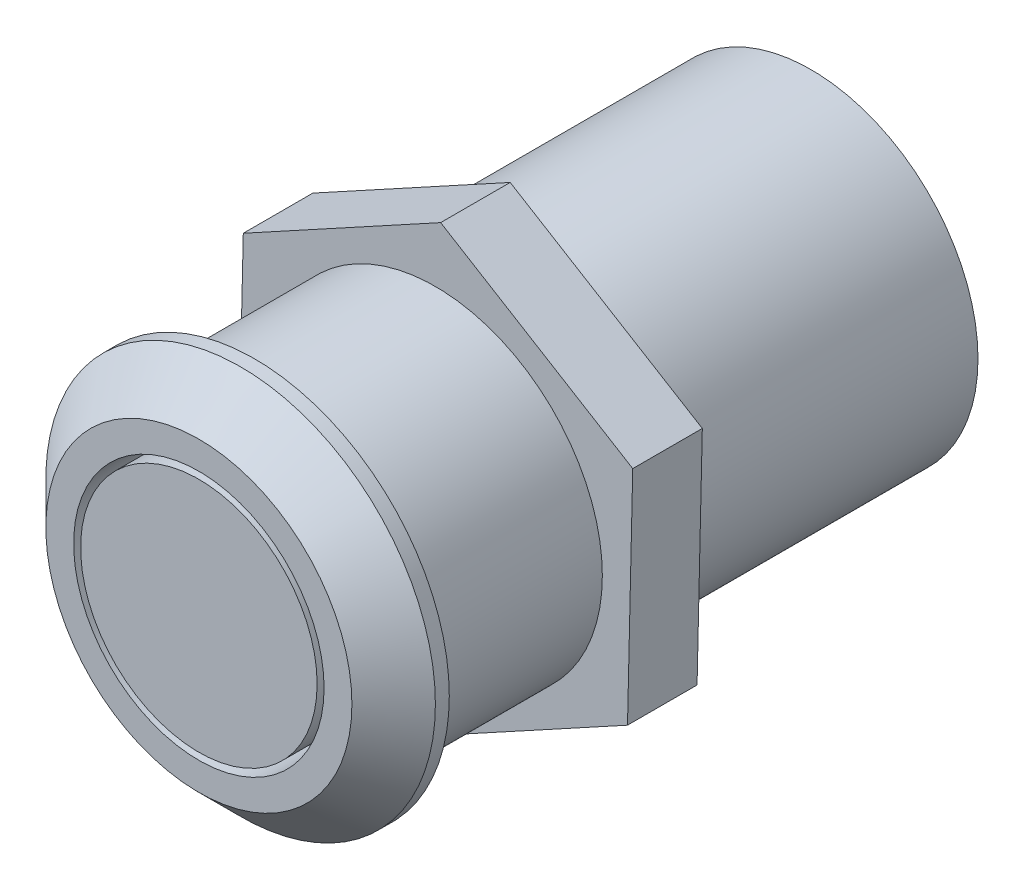
ISO-10303-21;
HEADER;
FILE_DESCRIPTION(('STEP AP214'),'2;1');
FILE_NAME('part.step','',(''),(''),'','','');
FILE_SCHEMA(('AUTOMOTIVE_DESIGN { 1 0 10303 214 1 1 1 1 }'));
ENDSEC;
DATA;
#1=APPLICATION_CONTEXT('core data for automotive mechanical design processes');
#2=APPLICATION_PROTOCOL_DEFINITION('international standard','automotive_design',2000,#1);
#3=PRODUCT_CONTEXT('',#1,'mechanical');
#4=PRODUCT('Part','Part','',(#3));
#5=PRODUCT_RELATED_PRODUCT_CATEGORY('part','',(#4));
#6=PRODUCT_DEFINITION_FORMATION('','',#4);
#7=PRODUCT_DEFINITION_CONTEXT('part definition',#1,'design');
#8=PRODUCT_DEFINITION('design','',#6,#7);
#9=PRODUCT_DEFINITION_SHAPE('','',#8);
#10=(LENGTH_UNIT() NAMED_UNIT(*) SI_UNIT(.MILLI.,.METRE.));
#11=(NAMED_UNIT(*) PLANE_ANGLE_UNIT() SI_UNIT($,.RADIAN.));
#12=(NAMED_UNIT(*) SI_UNIT($,.STERADIAN.) SOLID_ANGLE_UNIT());
#13=UNCERTAINTY_MEASURE_WITH_UNIT(LENGTH_MEASURE(1.E-05),#10,'distance_accuracy_value','');
#14=(GEOMETRIC_REPRESENTATION_CONTEXT(3) GLOBAL_UNCERTAINTY_ASSIGNED_CONTEXT((#13)) GLOBAL_UNIT_ASSIGNED_CONTEXT((#10,
#11,#12)) REPRESENTATION_CONTEXT('',''));
#15=CARTESIAN_POINT('',(0.,0.,0.));
#16=DIRECTION('',(0.,0.,1.));
#17=DIRECTION('',(1.,0.,0.));
#18=AXIS2_PLACEMENT_3D('',#15,#16,#17);
#19=CARTESIAN_POINT('',(0.,0.,0.));
#20=DIRECTION('',(0.,0.,1.));
#21=DIRECTION('',(1.,0.,0.));
#22=AXIS2_PLACEMENT_3D('',#19,#20,#21);
#23=PLANE('',#22);
#24=CARTESIAN_POINT('',(5.,0.,0.));
#25=DIRECTION('',(0.,0.,1.));
#26=DIRECTION('',(1.,0.,0.));
#27=AXIS2_PLACEMENT_3D('',#24,#25,#26);
#28=CIRCLE('',#27,0.5);
#29=CARTESIAN_POINT('',(4.5,0.,0.));
#30=VERTEX_POINT('',#29);
#31=EDGE_CURVE('E115',#30,#30,#28,.T.);
#32=ORIENTED_EDGE('',*,*,#31,.T.);
#33=EDGE_LOOP('',(#32));
#34=FACE_BOUND('',#33,.T.);
#35=CARTESIAN_POINT('',(-5.00000007450581,0.,0.));
#36=DIRECTION('',(0.,0.,1.));
#37=DIRECTION('',(1.,0.,0.));
#38=AXIS2_PLACEMENT_3D('',#35,#36,#37);
#39=CIRCLE('',#38,0.5);
#40=CARTESIAN_POINT('',(-5.50000007450581,0.,0.));
#41=VERTEX_POINT('',#40);
#42=EDGE_CURVE('E552',#41,#41,#39,.T.);
#43=ORIENTED_EDGE('',*,*,#42,.T.);
#44=EDGE_LOOP('',(#43));
#45=FACE_BOUND('',#44,.T.);
#46=CARTESIAN_POINT('',(0.,0.,0.));
#47=DIRECTION('',(0.,0.,1.));
#48=DIRECTION('',(1.,0.,0.));
#49=AXIS2_PLACEMENT_3D('',#46,#47,#48);
#50=CIRCLE('',#49,6.);
#51=CARTESIAN_POINT('',(-6.,0.,0.));
#52=VERTEX_POINT('',#51);
#53=EDGE_CURVE('E11',#52,#52,#50,.T.);
#54=ORIENTED_EDGE('',*,*,#53,.F.);
#55=EDGE_LOOP('',(#54));
#56=FACE_BOUND('',#55,.T.);
#57=ADVANCED_FACE('F17',(#34,#45,#56),#23,.F.);
#58=CARTESIAN_POINT('',(0.,0.,0.));
#59=DIRECTION('',(0.,0.,1.));
#60=DIRECTION('',(1.,0.,0.));
#61=AXIS2_PLACEMENT_3D('',#58,#59,#60);
#62=CYLINDRICAL_SURFACE('',#61,6.);
#63=CARTESIAN_POINT('',(0.,0.,11.));
#64=DIRECTION('',(0.,0.,-1.));
#65=DIRECTION('',(1.,0.,0.));
#66=AXIS2_PLACEMENT_3D('',#63,#64,#65);
#67=CIRCLE('',#66,6.);
#68=CARTESIAN_POINT('',(-6.,0.,11.));
#69=VERTEX_POINT('',#68);
#70=EDGE_CURVE('E109',#69,#69,#67,.T.);
#71=ORIENTED_EDGE('',*,*,#70,.T.);
#72=DIRECTION('',(0.,0.,-1.));
#73=VECTOR('',#72,1.);
#74=CARTESIAN_POINT('',(-6.,0.,0.));
#75=LINE('',#74,#73);
#76=EDGE_CURVE('E21',#69,#52,#75,.T.);
#77=ORIENTED_EDGE('',*,*,#76,.T.);
#78=ORIENTED_EDGE('',*,*,#53,.T.);
#79=ORIENTED_EDGE('',*,*,#76,.F.);
#80=EDGE_LOOP('',(#71,#77,#78,#79));
#81=FACE_BOUND('',#80,.T.);
#82=ADVANCED_FACE('F237',(#81),#62,.T.);
#83=CARTESIAN_POINT('',(0.,0.,20.));
#84=DIRECTION('',(0.,0.,1.));
#85=DIRECTION('',(0.,-1.,0.));
#86=AXIS2_PLACEMENT_3D('',#83,#84,#85);
#87=PLANE('',#86);
#88=CARTESIAN_POINT('',(0.,0.,20.));
#89=DIRECTION('',(0.,0.,1.));
#90=DIRECTION('',(1.,0.,0.));
#91=AXIS2_PLACEMENT_3D('',#88,#89,#90);
#92=CIRCLE('',#91,6.);
#93=CARTESIAN_POINT('',(-6.,0.,20.));
#94=VERTEX_POINT('',#93);
#95=EDGE_CURVE('E179',#94,#94,#92,.T.);
#96=ORIENTED_EDGE('',*,*,#95,.T.);
#97=EDGE_LOOP('',(#96));
#98=FACE_BOUND('',#97,.T.);
#99=CARTESIAN_POINT('',(0.,0.,20.));
#100=DIRECTION('',(0.,0.,1.));
#101=DIRECTION('',(-1.,0.,0.));
#102=AXIS2_PLACEMENT_3D('',#99,#100,#101);
#103=CIRCLE('',#102,7.);
#104=CARTESIAN_POINT('',(7.,0.,20.));
#105=VERTEX_POINT('',#104);
#106=EDGE_CURVE('E114',#105,#105,#103,.T.);
#107=ORIENTED_EDGE('',*,*,#106,.F.);
#108=EDGE_LOOP('',(#107));
#109=FACE_BOUND('',#108,.T.);
#110=ADVANCED_FACE('F19',(#98,#109),#87,.F.);
#111=CARTESIAN_POINT('',(0.,0.,20.));
#112=DIRECTION('',(0.,0.,1.));
#113=DIRECTION('',(0.,-1.,0.));
#114=AXIS2_PLACEMENT_3D('',#111,#112,#113);
#115=PLANE('',#114);
#116=CARTESIAN_POINT('',(0.,0.,20.));
#117=DIRECTION('',(0.,0.,-1.));
#118=DIRECTION('',(-1.,0.,0.));
#119=AXIS2_PLACEMENT_3D('',#116,#117,#118);
#120=CIRCLE('',#119,4.25);
#121=CARTESIAN_POINT('',(4.24999999999993,0.,20.));
#122=VERTEX_POINT('',#121);
#123=EDGE_CURVE('E85',#122,#122,#120,.T.);
#124=ORIENTED_EDGE('',*,*,#123,.T.);
#125=EDGE_LOOP('',(#124));
#126=FACE_BOUND('',#125,.T.);
#127=CARTESIAN_POINT('',(0.,0.,20.));
#128=DIRECTION('',(0.,0.,-1.));
#129=DIRECTION('',(-1.,0.,0.));
#130=AXIS2_PLACEMENT_3D('',#127,#128,#129);
#131=CIRCLE('',#130,4.5);
#132=CARTESIAN_POINT('',(4.49999999999993,0.,20.));
#133=VERTEX_POINT('',#132);
#134=EDGE_CURVE('E49',#133,#133,#131,.T.);
#135=ORIENTED_EDGE('',*,*,#134,.F.);
#136=EDGE_LOOP('',(#135));
#137=FACE_BOUND('',#136,.T.);
#138=ADVANCED_FACE('F236',(#126,#137),#115,.T.);
#139=CARTESIAN_POINT('',(0.,0.,22.));
#140=DIRECTION('',(0.,0.,-1.));
#141=DIRECTION('',(-1.,0.,0.));
#142=AXIS2_PLACEMENT_3D('',#139,#140,#141);
#143=CYLINDRICAL_SURFACE('',#142,4.5);
#144=CARTESIAN_POINT('',(0.,0.,22.));
#145=DIRECTION('',(0.,0.,-1.));
#146=DIRECTION('',(-1.,0.,0.));
#147=AXIS2_PLACEMENT_3D('',#144,#145,#146);
#148=CIRCLE('',#147,4.5);
#149=CARTESIAN_POINT('',(4.49999999999993,0.,22.));
#150=VERTEX_POINT('',#149);
#151=EDGE_CURVE('E95',#150,#150,#148,.T.);
#152=ORIENTED_EDGE('',*,*,#151,.F.);
#153=DIRECTION('',(0.,0.,-1.));
#154=VECTOR('',#153,1.);
#155=CARTESIAN_POINT('',(4.49999999999993,0.,22.));
#156=LINE('',#155,#154);
#157=EDGE_CURVE('E93',#150,#133,#156,.T.);
#158=ORIENTED_EDGE('',*,*,#157,.T.);
#159=ORIENTED_EDGE('',*,*,#134,.T.);
#160=ORIENTED_EDGE('',*,*,#157,.F.);
#161=EDGE_LOOP('',(#152,#158,#159,#160));
#162=FACE_BOUND('',#161,.T.);
#163=ADVANCED_FACE('F245',(#162),#143,.F.);
#164=CARTESIAN_POINT('',(0.,0.,22.));
#165=DIRECTION('',(0.,0.,1.));
#166=DIRECTION('',(0.,-1.,0.));
#167=AXIS2_PLACEMENT_3D('',#164,#165,#166);
#168=PLANE('',#167);
#169=CARTESIAN_POINT('',(0.,0.,22.));
#170=DIRECTION('',(0.,0.,-1.));
#171=DIRECTION('',(-1.,0.,0.));
#172=AXIS2_PLACEMENT_3D('',#169,#170,#171);
#173=CIRCLE('',#172,4.25);
#174=CARTESIAN_POINT('',(4.24999999999993,0.,22.));
#175=VERTEX_POINT('',#174);
#176=EDGE_CURVE('E84',#175,#175,#173,.T.);
#177=ORIENTED_EDGE('',*,*,#176,.F.);
#178=EDGE_LOOP('',(#177));
#179=FACE_BOUND('',#178,.T.);
#180=ADVANCED_FACE('F296',(#179),#168,.T.);
#181=CARTESIAN_POINT('',(0.,0.,20.));
#182=DIRECTION('',(0.,0.,1.));
#183=DIRECTION('',(-1.,0.,0.));
#184=AXIS2_PLACEMENT_3D('',#181,#182,#183);
#185=CYLINDRICAL_SURFACE('',#184,4.25);
#186=ORIENTED_EDGE('',*,*,#176,.T.);
#187=DIRECTION('',(0.,0.,-1.));
#188=VECTOR('',#187,1.);
#189=CARTESIAN_POINT('',(4.24999999999993,0.,20.));
#190=LINE('',#189,#188);
#191=EDGE_CURVE('E81',#175,#122,#190,.T.);
#192=ORIENTED_EDGE('',*,*,#191,.T.);
#193=ORIENTED_EDGE('',*,*,#123,.F.);
#194=ORIENTED_EDGE('',*,*,#191,.F.);
#195=EDGE_LOOP('',(#186,#192,#193,#194));
#196=FACE_BOUND('',#195,.T.);
#197=ADVANCED_FACE('F82',(#196),#185,.T.);
#198=CARTESIAN_POINT('',(0.,0.,22.));
#199=DIRECTION('',(0.,0.,1.));
#200=DIRECTION('',(0.,-1.,0.));
#201=AXIS2_PLACEMENT_3D('',#198,#199,#200);
#202=PLANE('',#201);
#203=ORIENTED_EDGE('',*,*,#151,.T.);
#204=EDGE_LOOP('',(#203));
#205=FACE_BOUND('',#204,.T.);
#206=CARTESIAN_POINT('',(0.,0.,22.));
#207=DIRECTION('',(0.,0.,-1.));
#208=DIRECTION('',(-1.,0.,0.));
#209=AXIS2_PLACEMENT_3D('',#206,#207,#208);
#210=CIRCLE('',#209,5.5);
#211=CARTESIAN_POINT('',(5.49999999999993,0.,22.));
#212=VERTEX_POINT('',#211);
#213=EDGE_CURVE('E121',#212,#212,#210,.T.);
#214=ORIENTED_EDGE('',*,*,#213,.F.);
#215=EDGE_LOOP('',(#214));
#216=FACE_BOUND('',#215,.T.);
#217=ADVANCED_FACE('F292',(#205,#216),#202,.T.);
#218=CARTESIAN_POINT('',(0.,0.,20.));
#219=DIRECTION('',(0.,0.,1.));
#220=DIRECTION('',(-1.,0.,0.));
#221=AXIS2_PLACEMENT_3D('',#218,#219,#220);
#222=CYLINDRICAL_SURFACE('',#221,7.);
#223=CARTESIAN_POINT('',(0.,0.,20.5));
#224=DIRECTION('',(0.,0.,1.));
#225=DIRECTION('',(-1.,0.,0.));
#226=AXIS2_PLACEMENT_3D('',#223,#224,#225);
#227=CIRCLE('',#226,7.);
#228=CARTESIAN_POINT('',(7.,0.,20.5));
#229=VERTEX_POINT('',#228);
#230=EDGE_CURVE('E219',#229,#229,#227,.T.);
#231=ORIENTED_EDGE('',*,*,#230,.F.);
#232=DIRECTION('',(0.,0.,-1.));
#233=VECTOR('',#232,1.);
#234=CARTESIAN_POINT('',(7.,0.,20.));
#235=LINE('',#234,#233);
#236=EDGE_CURVE('E224',#229,#105,#235,.T.);
#237=ORIENTED_EDGE('',*,*,#236,.T.);
#238=ORIENTED_EDGE('',*,*,#106,.T.);
#239=ORIENTED_EDGE('',*,*,#236,.F.);
#240=EDGE_LOOP('',(#231,#237,#238,#239));
#241=FACE_BOUND('',#240,.T.);
#242=ADVANCED_FACE('F233',(#241),#222,.T.);
#243=CARTESIAN_POINT('',(0.,0.,21.25));
#244=DIRECTION('',(0.,0.,-1.));
#245=DIRECTION('',(-1.,0.,0.));
#246=AXIS2_PLACEMENT_3D('',#243,#244,#245);
#247=CONICAL_SURFACE('',#246,6.25,0.785398163397448);
#248=ORIENTED_EDGE('',*,*,#213,.T.);
#249=DIRECTION('',(0.707106781186547,0.,-0.707106781186548));
#250=VECTOR('',#249,1.);
#251=CARTESIAN_POINT('',(6.24999999999993,0.,21.25));
#252=LINE('',#251,#250);
#253=EDGE_CURVE('E125',#212,#229,#252,.T.);
#254=ORIENTED_EDGE('',*,*,#253,.T.);
#255=ORIENTED_EDGE('',*,*,#230,.T.);
#256=ORIENTED_EDGE('',*,*,#253,.F.);
#257=EDGE_LOOP('',(#248,#254,#255,#256));
#258=FACE_BOUND('',#257,.T.);
#259=ADVANCED_FACE('F264',(#258),#247,.T.);
#260=CARTESIAN_POINT('',(0.,0.,0.));
#261=DIRECTION('',(0.,0.,1.));
#262=DIRECTION('',(1.,0.,0.));
#263=AXIS2_PLACEMENT_3D('',#260,#261,#262);
#264=CYLINDRICAL_SURFACE('',#263,6.);
#265=ORIENTED_EDGE('',*,*,#95,.F.);
#266=DIRECTION('',(0.,0.,-1.));
#267=VECTOR('',#266,1.);
#268=CARTESIAN_POINT('',(-6.,0.,0.));
#269=LINE('',#268,#267);
#270=CARTESIAN_POINT('',(-6.,0.,13.5));
#271=VERTEX_POINT('',#270);
#272=EDGE_CURVE('E126',#94,#271,#269,.T.);
#273=ORIENTED_EDGE('',*,*,#272,.T.);
#274=CARTESIAN_POINT('',(0.,0.,13.5));
#275=DIRECTION('',(0.,0.,1.));
#276=DIRECTION('',(1.,0.,0.));
#277=AXIS2_PLACEMENT_3D('',#274,#275,#276);
#278=CIRCLE('',#277,6.);
#279=EDGE_CURVE('E187',#271,#271,#278,.T.);
#280=ORIENTED_EDGE('',*,*,#279,.T.);
#281=ORIENTED_EDGE('',*,*,#272,.F.);
#282=EDGE_LOOP('',(#265,#273,#280,#281));
#283=FACE_BOUND('',#282,.T.);
#284=ADVANCED_FACE('F267',(#283),#264,.T.);
#285=CARTESIAN_POINT('',(-6.90386553885819,4.20356681339779,13.5));
#286=DIRECTION('',(-0.479671618669971,0.877448082932848,0.));
#287=DIRECTION('',(0.,0.,1.));
#288=AXIS2_PLACEMENT_3D('',#285,#286,#287);
#289=PLANE('',#288);
#290=DIRECTION('',(0.877448082932848,0.479671618669971,0.));
#291=VECTOR('',#290,1.);
#292=CARTESIAN_POINT('',(-6.90386553885819,4.20356681339779,13.5));
#293=LINE('',#292,#291);
#294=CARTESIAN_POINT('',(-6.90386553885819,4.20356681339779,13.5));
#295=VERTEX_POINT('',#294);
#296=CARTESIAN_POINT('',(0.188462877478621,8.08070634766203,13.5));
#297=VERTEX_POINT('',#296);
#298=EDGE_CURVE('E131',#295,#297,#293,.T.);
#299=ORIENTED_EDGE('',*,*,#298,.T.);
#300=DIRECTION('',(0.,0.,-1.));
#301=VECTOR('',#300,1.);
#302=CARTESIAN_POINT('',(0.188462877478621,8.08070634766203,13.5));
#303=LINE('',#302,#301);
#304=CARTESIAN_POINT('',(0.188462877478619,8.08070634766204,11.));
#305=VERTEX_POINT('',#304);
#306=EDGE_CURVE('E183',#297,#305,#303,.T.);
#307=ORIENTED_EDGE('',*,*,#306,.T.);
#308=DIRECTION('',(0.877448082932848,0.479671618669971,0.));
#309=VECTOR('',#308,1.);
#310=CARTESIAN_POINT('',(-6.9038655388582,4.20356681339779,11.));
#311=LINE('',#310,#309);
#312=CARTESIAN_POINT('',(-6.9038655388582,4.20356681339779,11.));
#313=VERTEX_POINT('',#312);
#314=EDGE_CURVE('E141',#313,#305,#311,.T.);
#315=ORIENTED_EDGE('',*,*,#314,.F.);
#316=DIRECTION('',(0.,0.,-1.));
#317=VECTOR('',#316,1.);
#318=CARTESIAN_POINT('',(-6.90386553885819,4.20356681339779,13.5));
#319=LINE('',#318,#317);
#320=EDGE_CURVE('E191',#295,#313,#319,.T.);
#321=ORIENTED_EDGE('',*,*,#320,.F.);
#322=EDGE_LOOP('',(#299,#307,#315,#321));
#323=FACE_BOUND('',#322,.T.);
#324=ADVANCED_FACE('F285',(#323),#289,.T.);
#325=CARTESIAN_POINT('',(0.188462877478621,8.08070634766203,13.5));
#326=DIRECTION('',(0.520056520986816,0.854131848709021,0.));
#327=DIRECTION('',(0.,0.,-1.));
#328=AXIS2_PLACEMENT_3D('',#325,#326,#327);
#329=PLANE('',#328);
#330=DIRECTION('',(0.854131848709021,-0.520056520986816,0.));
#331=VECTOR('',#330,1.);
#332=CARTESIAN_POINT('',(0.188462877478621,8.08070634766203,13.5));
#333=LINE('',#332,#331);
#334=CARTESIAN_POINT('',(7.09232841633682,3.87713953426422,13.5));
#335=VERTEX_POINT('',#334);
#336=EDGE_CURVE('E178',#297,#335,#333,.T.);
#337=ORIENTED_EDGE('',*,*,#336,.T.);
#338=DIRECTION('',(0.,0.,-1.));
#339=VECTOR('',#338,1.);
#340=CARTESIAN_POINT('',(7.09232841633682,3.87713953426422,13.5));
#341=LINE('',#340,#339);
#342=CARTESIAN_POINT('',(7.09232841633682,3.87713953426422,11.));
#343=VERTEX_POINT('',#342);
#344=EDGE_CURVE('E207',#335,#343,#341,.T.);
#345=ORIENTED_EDGE('',*,*,#344,.T.);
#346=DIRECTION('',(0.854131848709021,-0.520056520986816,0.));
#347=VECTOR('',#346,1.);
#348=CARTESIAN_POINT('',(0.188462877478619,8.08070634766204,11.));
#349=LINE('',#348,#347);
#350=EDGE_CURVE('E145',#305,#343,#349,.T.);
#351=ORIENTED_EDGE('',*,*,#350,.F.);
#352=ORIENTED_EDGE('',*,*,#306,.F.);
#353=EDGE_LOOP('',(#337,#345,#351,#352));
#354=FACE_BOUND('',#353,.T.);
#355=ADVANCED_FACE('F283',(#354),#329,.T.);
#356=CARTESIAN_POINT('',(7.09232841633682,3.87713953426422,13.5));
#357=DIRECTION('',(0.999728139656787,-0.0233162342238269,0.));
#358=DIRECTION('',(0.,0.,-1.));
#359=AXIS2_PLACEMENT_3D('',#356,#357,#358);
#360=PLANE('',#359);
#361=DIRECTION('',(-0.0233162342238269,-0.999728139656787,0.));
#362=VECTOR('',#361,1.);
#363=CARTESIAN_POINT('',(7.09232841633682,3.87713953426422,13.5));
#364=LINE('',#363,#362);
#365=CARTESIAN_POINT('',(6.90386553885821,-4.20356681339784,13.5));
#366=VERTEX_POINT('',#365);
#367=EDGE_CURVE('E174',#335,#366,#364,.T.);
#368=ORIENTED_EDGE('',*,*,#367,.T.);
#369=DIRECTION('',(0.,0.,-1.));
#370=VECTOR('',#369,1.);
#371=CARTESIAN_POINT('',(6.90386553885821,-4.20356681339784,13.5));
#372=LINE('',#371,#370);
#373=CARTESIAN_POINT('',(6.90386553885821,-4.20356681339783,11.));
#374=VERTEX_POINT('',#373);
#375=EDGE_CURVE('E203',#366,#374,#372,.T.);
#376=ORIENTED_EDGE('',*,*,#375,.T.);
#377=DIRECTION('',(-0.0233162342238269,-0.999728139656787,0.));
#378=VECTOR('',#377,1.);
#379=CARTESIAN_POINT('',(7.09232841633682,3.87713953426422,11.));
#380=LINE('',#379,#378);
#381=EDGE_CURVE('E152',#343,#374,#380,.T.);
#382=ORIENTED_EDGE('',*,*,#381,.F.);
#383=ORIENTED_EDGE('',*,*,#344,.F.);
#384=EDGE_LOOP('',(#368,#376,#382,#383));
#385=FACE_BOUND('',#384,.T.);
#386=ADVANCED_FACE('F279',(#385),#360,.T.);
#387=CARTESIAN_POINT('',(6.90386553885821,-4.20356681339784,13.5));
#388=DIRECTION('',(0.479671618669971,-0.877448082932848,0.));
#389=DIRECTION('',(0.,0.,-1.));
#390=AXIS2_PLACEMENT_3D('',#387,#388,#389);
#391=PLANE('',#390);
#392=DIRECTION('',(-0.877448082932848,-0.479671618669971,0.));
#393=VECTOR('',#392,1.);
#394=CARTESIAN_POINT('',(6.90386553885821,-4.20356681339784,13.5));
#395=LINE('',#394,#393);
#396=CARTESIAN_POINT('',(-0.188462877478595,-8.08070634766208,13.5));
#397=VERTEX_POINT('',#396);
#398=EDGE_CURVE('E170',#366,#397,#395,.T.);
#399=ORIENTED_EDGE('',*,*,#398,.T.);
#400=DIRECTION('',(0.,0.,-1.));
#401=VECTOR('',#400,1.);
#402=CARTESIAN_POINT('',(-0.188462877478595,-8.08070634766208,13.5));
#403=LINE('',#402,#401);
#404=CARTESIAN_POINT('',(-0.188462877478598,-8.08070634766207,11.));
#405=VERTEX_POINT('',#404);
#406=EDGE_CURVE('E199',#397,#405,#403,.T.);
#407=ORIENTED_EDGE('',*,*,#406,.T.);
#408=DIRECTION('',(-0.877448082932848,-0.479671618669971,0.));
#409=VECTOR('',#408,1.);
#410=CARTESIAN_POINT('',(6.90386553885821,-4.20356681339783,11.));
#411=LINE('',#410,#409);
#412=EDGE_CURVE('E153',#374,#405,#411,.T.);
#413=ORIENTED_EDGE('',*,*,#412,.F.);
#414=ORIENTED_EDGE('',*,*,#375,.F.);
#415=EDGE_LOOP('',(#399,#407,#413,#414));
#416=FACE_BOUND('',#415,.T.);
#417=ADVANCED_FACE('F275',(#416),#391,.T.);
#418=CARTESIAN_POINT('',(-0.188462877478595,-8.08070634766208,13.5));
#419=DIRECTION('',(-0.520056520986815,-0.854131848709021,0.));
#420=DIRECTION('',(-0.854131848709021,0.520056520986815,0.));
#421=AXIS2_PLACEMENT_3D('',#418,#419,#420);
#422=PLANE('',#421);
#423=DIRECTION('',(-0.854131848709021,0.520056520986815,0.));
#424=VECTOR('',#423,1.);
#425=CARTESIAN_POINT('',(-0.188462877478595,-8.08070634766208,13.5));
#426=LINE('',#425,#424);
#427=CARTESIAN_POINT('',(-7.0923284163368,-3.87713953426426,13.5));
#428=VERTEX_POINT('',#427);
#429=EDGE_CURVE('E160',#397,#428,#426,.T.);
#430=ORIENTED_EDGE('',*,*,#429,.T.);
#431=DIRECTION('',(0.,0.,-1.));
#432=VECTOR('',#431,1.);
#433=CARTESIAN_POINT('',(-7.0923284163368,-3.87713953426426,13.5));
#434=LINE('',#433,#432);
#435=CARTESIAN_POINT('',(-7.0923284163368,-3.87713953426426,11.));
#436=VERTEX_POINT('',#435);
#437=EDGE_CURVE('E195',#428,#436,#434,.T.);
#438=ORIENTED_EDGE('',*,*,#437,.T.);
#439=DIRECTION('',(-0.854131848709021,0.520056520986815,0.));
#440=VECTOR('',#439,1.);
#441=CARTESIAN_POINT('',(-0.188462877478598,-8.08070634766207,11.));
#442=LINE('',#441,#440);
#443=EDGE_CURVE('E140',#405,#436,#442,.T.);
#444=ORIENTED_EDGE('',*,*,#443,.F.);
#445=ORIENTED_EDGE('',*,*,#406,.F.);
#446=EDGE_LOOP('',(#430,#438,#444,#445));
#447=FACE_BOUND('',#446,.T.);
#448=ADVANCED_FACE('F271',(#447),#422,.T.);
#449=CARTESIAN_POINT('',(-7.0923284163368,-3.87713953426426,13.5));
#450=DIRECTION('',(-0.999728139656787,0.0233162342238267,0.));
#451=DIRECTION('',(0.,0.,1.));
#452=AXIS2_PLACEMENT_3D('',#449,#450,#451);
#453=PLANE('',#452);
#454=DIRECTION('',(0.0233162342238267,0.999728139656787,0.));
#455=VECTOR('',#454,1.);
#456=CARTESIAN_POINT('',(-7.0923284163368,-3.87713953426426,13.5));
#457=LINE('',#456,#455);
#458=EDGE_CURVE('E135',#428,#295,#457,.T.);
#459=ORIENTED_EDGE('',*,*,#458,.T.);
#460=ORIENTED_EDGE('',*,*,#320,.T.);
#461=DIRECTION('',(0.0233162342238267,0.999728139656787,0.));
#462=VECTOR('',#461,1.);
#463=CARTESIAN_POINT('',(-7.0923284163368,-3.87713953426426,11.));
#464=LINE('',#463,#462);
#465=EDGE_CURVE('E136',#436,#313,#464,.T.);
#466=ORIENTED_EDGE('',*,*,#465,.F.);
#467=ORIENTED_EDGE('',*,*,#437,.F.);
#468=EDGE_LOOP('',(#459,#460,#466,#467));
#469=FACE_BOUND('',#468,.T.);
#470=ADVANCED_FACE('F262',(#469),#453,.T.);
#471=CARTESIAN_POINT('',(0.,0.,13.5));
#472=DIRECTION('',(0.,0.,-1.));
#473=DIRECTION('',(-1.,0.,0.));
#474=AXIS2_PLACEMENT_3D('',#471,#472,#473);
#475=PLANE('',#474);
#476=ORIENTED_EDGE('',*,*,#279,.F.);
#477=EDGE_LOOP('',(#476));
#478=FACE_BOUND('',#477,.T.);
#479=ORIENTED_EDGE('',*,*,#298,.F.);
#480=ORIENTED_EDGE('',*,*,#458,.F.);
#481=ORIENTED_EDGE('',*,*,#429,.F.);
#482=ORIENTED_EDGE('',*,*,#398,.F.);
#483=ORIENTED_EDGE('',*,*,#367,.F.);
#484=ORIENTED_EDGE('',*,*,#336,.F.);
#485=EDGE_LOOP('',(#479,#480,#481,#482,#483,#484));
#486=FACE_BOUND('',#485,.T.);
#487=ADVANCED_FACE('F259',(#478,#486),#475,.F.);
#488=CARTESIAN_POINT('',(0.,0.,11.));
#489=DIRECTION('',(0.,0.,-1.));
#490=DIRECTION('',(-1.,0.,0.));
#491=AXIS2_PLACEMENT_3D('',#488,#489,#490);
#492=PLANE('',#491);
#493=ORIENTED_EDGE('',*,*,#70,.F.);
#494=EDGE_LOOP('',(#493));
#495=FACE_BOUND('',#494,.T.);
#496=ORIENTED_EDGE('',*,*,#314,.T.);
#497=ORIENTED_EDGE('',*,*,#350,.T.);
#498=ORIENTED_EDGE('',*,*,#381,.T.);
#499=ORIENTED_EDGE('',*,*,#412,.T.);
#500=ORIENTED_EDGE('',*,*,#443,.T.);
#501=ORIENTED_EDGE('',*,*,#465,.T.);
#502=EDGE_LOOP('',(#496,#497,#498,#499,#500,#501));
#503=FACE_BOUND('',#502,.T.);
#504=ADVANCED_FACE('F257',(#495,#503),#492,.T.);
#505=CARTESIAN_POINT('',(5.,0.,5.));
#506=DIRECTION('',(0.,0.,-1.));
#507=DIRECTION('',(0.,-1.,0.));
#508=AXIS2_PLACEMENT_3D('',#505,#506,#507);
#509=PLANE('',#508);
#510=CARTESIAN_POINT('',(5.,0.,5.));
#511=DIRECTION('',(0.,0.,1.));
#512=DIRECTION('',(1.,0.,0.));
#513=AXIS2_PLACEMENT_3D('',#510,#511,#512);
#514=CIRCLE('',#513,0.5);
#515=CARTESIAN_POINT('',(4.5,0.,5.));
#516=VERTEX_POINT('',#515);
#517=EDGE_CURVE('E130',#516,#516,#514,.T.);
#518=ORIENTED_EDGE('',*,*,#517,.F.);
#519=EDGE_LOOP('',(#518));
#520=FACE_BOUND('',#519,.T.);
#521=ADVANCED_FACE('F390',(#520),#509,.T.);
#522=CARTESIAN_POINT('',(5.,0.,0.));
#523=DIRECTION('',(0.,0.,1.));
#524=DIRECTION('',(1.,0.,0.));
#525=AXIS2_PLACEMENT_3D('',#522,#523,#524);
#526=CYLINDRICAL_SURFACE('',#525,0.5);
#527=ORIENTED_EDGE('',*,*,#31,.F.);
#528=DIRECTION('',(0.,0.,1.));
#529=VECTOR('',#528,1.);
#530=CARTESIAN_POINT('',(4.5,0.,0.));
#531=LINE('',#530,#529);
#532=EDGE_CURVE('E119',#30,#516,#531,.T.);
#533=ORIENTED_EDGE('',*,*,#532,.T.);
#534=ORIENTED_EDGE('',*,*,#517,.T.);
#535=ORIENTED_EDGE('',*,*,#532,.F.);
#536=EDGE_LOOP('',(#527,#533,#534,#535));
#537=FACE_BOUND('',#536,.T.);
#538=ADVANCED_FACE('F398',(#537),#526,.F.);
#539=CARTESIAN_POINT('',(-5.00000007450581,0.,5.));
#540=DIRECTION('',(0.,0.,-1.));
#541=DIRECTION('',(0.,-1.,0.));
#542=AXIS2_PLACEMENT_3D('',#539,#540,#541);
#543=PLANE('',#542);
#544=CARTESIAN_POINT('',(-5.00000007450581,0.,5.));
#545=DIRECTION('',(0.,0.,1.));
#546=DIRECTION('',(1.,0.,0.));
#547=AXIS2_PLACEMENT_3D('',#544,#545,#546);
#548=CIRCLE('',#547,0.5);
#549=CARTESIAN_POINT('',(-5.50000007450581,0.,5.));
#550=VERTEX_POINT('',#549);
#551=EDGE_CURVE('E120',#550,#550,#548,.T.);
#552=ORIENTED_EDGE('',*,*,#551,.F.);
#553=EDGE_LOOP('',(#552));
#554=FACE_BOUND('',#553,.T.);
#555=ADVANCED_FACE('F407',(#554),#543,.T.);
#556=CARTESIAN_POINT('',(-5.00000007450581,0.,0.));
#557=DIRECTION('',(0.,0.,1.));
#558=DIRECTION('',(1.,0.,0.));
#559=AXIS2_PLACEMENT_3D('',#556,#557,#558);
#560=CYLINDRICAL_SURFACE('',#559,0.5);
#561=ORIENTED_EDGE('',*,*,#42,.F.);
#562=DIRECTION('',(0.,0.,1.));
#563=VECTOR('',#562,1.);
#564=CARTESIAN_POINT('',(-5.50000007450581,0.,0.));
#565=LINE('',#564,#563);
#566=EDGE_CURVE('E545',#41,#550,#565,.T.);
#567=ORIENTED_EDGE('',*,*,#566,.T.);
#568=ORIENTED_EDGE('',*,*,#551,.T.);
#569=ORIENTED_EDGE('',*,*,#566,.F.);
#570=EDGE_LOOP('',(#561,#567,#568,#569));
#571=FACE_BOUND('',#570,.T.);
#572=ADVANCED_FACE('F416',(#571),#560,.F.);
#573=CLOSED_SHELL('',(#57,#82,#110,#138,#163,#180,#197,#217,#242,#259,#284,#324,#355,#386,#417,
#448,#470,#487,#504,#521,#538,#555,#572));
#574=MANIFOLD_SOLID_BREP('B1',#573);
#575=ADVANCED_BREP_SHAPE_REPRESENTATION('',(#18,#574),#14);
#576=SHAPE_DEFINITION_REPRESENTATION(#9,#575);
ENDSEC;
END-ISO-10303-21;
